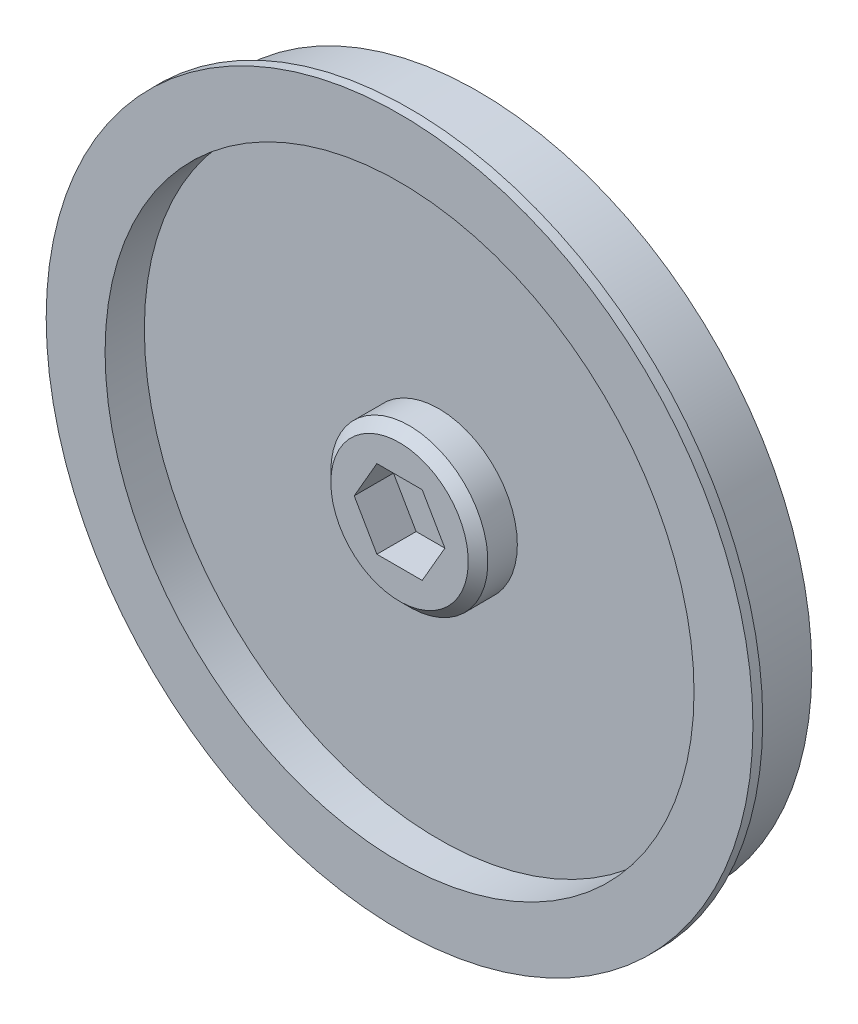
ISO-10303-21;
HEADER;
FILE_DESCRIPTION(('STEP AP214'),'2;1');
FILE_NAME('part.step','',(''),(''),'','','');
FILE_SCHEMA(('AUTOMOTIVE_DESIGN { 1 0 10303 214 1 1 1 1 }'));
ENDSEC;
DATA;
#1=APPLICATION_CONTEXT('core data for automotive mechanical design processes');
#2=APPLICATION_PROTOCOL_DEFINITION('international standard','automotive_design',2000,#1);
#3=PRODUCT_CONTEXT('',#1,'mechanical');
#4=PRODUCT('Part','Part','',(#3));
#5=PRODUCT_RELATED_PRODUCT_CATEGORY('part','',(#4));
#6=PRODUCT_DEFINITION_FORMATION('','',#4);
#7=PRODUCT_DEFINITION_CONTEXT('part definition',#1,'design');
#8=PRODUCT_DEFINITION('design','',#6,#7);
#9=PRODUCT_DEFINITION_SHAPE('','',#8);
#10=(LENGTH_UNIT() NAMED_UNIT(*) SI_UNIT(.MILLI.,.METRE.));
#11=(NAMED_UNIT(*) PLANE_ANGLE_UNIT() SI_UNIT($,.RADIAN.));
#12=(NAMED_UNIT(*) SI_UNIT($,.STERADIAN.) SOLID_ANGLE_UNIT());
#13=UNCERTAINTY_MEASURE_WITH_UNIT(LENGTH_MEASURE(1.E-05),#10,'distance_accuracy_value','');
#14=(GEOMETRIC_REPRESENTATION_CONTEXT(3) GLOBAL_UNCERTAINTY_ASSIGNED_CONTEXT((#13)) GLOBAL_UNIT_ASSIGNED_CONTEXT((#10,
#11,#12)) REPRESENTATION_CONTEXT('',''));
#15=CARTESIAN_POINT('',(0.,0.,0.));
#16=DIRECTION('',(0.,0.,1.));
#17=DIRECTION('',(1.,0.,0.));
#18=AXIS2_PLACEMENT_3D('',#15,#16,#17);
#19=CARTESIAN_POINT('',(0.,0.,6.35));
#20=DIRECTION('',(0.,0.,1.));
#21=DIRECTION('',(1.,0.,0.));
#22=AXIS2_PLACEMENT_3D('',#19,#20,#21);
#23=PLANE('',#22);
#24=CARTESIAN_POINT('',(0.,0.,6.35));
#25=DIRECTION('',(0.,0.,1.));
#26=DIRECTION('',(1.,0.,0.));
#27=AXIS2_PLACEMENT_3D('',#24,#25,#26);
#28=CIRCLE('',#27,47.625);
#29=CARTESIAN_POINT('',(47.625,0.,6.35));
#30=VERTEX_POINT('',#29);
#31=EDGE_CURVE('E140',#30,#30,#28,.T.);
#32=ORIENTED_EDGE('',*,*,#31,.T.);
#33=EDGE_LOOP('',(#32));
#34=FACE_BOUND('',#33,.T.);
#35=CARTESIAN_POINT('',(0.,0.,6.35));
#36=DIRECTION('',(0.,0.,1.));
#37=DIRECTION('',(1.,0.,0.));
#38=AXIS2_PLACEMENT_3D('',#35,#36,#37);
#39=CIRCLE('',#38,12.7);
#40=CARTESIAN_POINT('',(12.7,0.,6.35));
#41=VERTEX_POINT('',#40);
#42=EDGE_CURVE('E100',#41,#41,#39,.T.);
#43=ORIENTED_EDGE('',*,*,#42,.F.);
#44=EDGE_LOOP('',(#43));
#45=FACE_BOUND('',#44,.T.);
#46=ADVANCED_FACE('F33',(#34,#45),#23,.T.);
#47=CARTESIAN_POINT('',(0.,0.,11.1125));
#48=DIRECTION('',(0.,0.,-1.));
#49=DIRECTION('',(-1.,0.,0.));
#50=AXIS2_PLACEMENT_3D('',#47,#48,#49);
#51=CYLINDRICAL_SURFACE('',#50,53.975);
#52=CARTESIAN_POINT('',(0.,0.,11.1125));
#53=DIRECTION('',(0.,0.,1.));
#54=DIRECTION('',(1.,0.,0.));
#55=AXIS2_PLACEMENT_3D('',#52,#53,#54);
#56=CIRCLE('',#55,53.975);
#57=CARTESIAN_POINT('',(53.975,0.,11.1125));
#58=VERTEX_POINT('',#57);
#59=EDGE_CURVE('E152',#58,#58,#56,.T.);
#60=ORIENTED_EDGE('',*,*,#59,.F.);
#61=EDGE_LOOP('',(#60));
#62=FACE_BOUND('',#61,.T.);
#63=CARTESIAN_POINT('',(0.,0.,0.));
#64=DIRECTION('',(0.,0.,1.));
#65=DIRECTION('',(1.,0.,0.));
#66=AXIS2_PLACEMENT_3D('',#63,#64,#65);
#67=CIRCLE('',#66,53.975);
#68=CARTESIAN_POINT('',(53.975,0.,0.));
#69=VERTEX_POINT('',#68);
#70=EDGE_CURVE('E149',#69,#69,#67,.T.);
#71=ORIENTED_EDGE('',*,*,#70,.T.);
#72=EDGE_LOOP('',(#71));
#73=FACE_BOUND('',#72,.T.);
#74=ADVANCED_FACE('F170',(#62,#73),#51,.T.);
#75=CARTESIAN_POINT('',(0.,0.,0.));
#76=DIRECTION('',(0.,0.,1.));
#77=DIRECTION('',(1.,0.,0.));
#78=AXIS2_PLACEMENT_3D('',#75,#76,#77);
#79=PLANE('',#78);
#80=ORIENTED_EDGE('',*,*,#70,.F.);
#81=EDGE_LOOP('',(#80));
#82=FACE_BOUND('',#81,.T.);
#83=ADVANCED_FACE('F175',(#82),#79,.F.);
#84=CARTESIAN_POINT('',(0.,0.,11.1125));
#85=DIRECTION('',(0.,0.,1.));
#86=DIRECTION('',(1.,0.,0.));
#87=AXIS2_PLACEMENT_3D('',#84,#85,#86);
#88=PLANE('',#87);
#89=CARTESIAN_POINT('',(0.,0.,11.1125));
#90=DIRECTION('',(0.,0.,1.));
#91=DIRECTION('',(1.,0.,0.));
#92=AXIS2_PLACEMENT_3D('',#89,#90,#91);
#93=CIRCLE('',#92,57.15);
#94=CARTESIAN_POINT('',(57.15,0.,11.1125));
#95=VERTEX_POINT('',#94);
#96=EDGE_CURVE('E143',#95,#95,#93,.T.);
#97=ORIENTED_EDGE('',*,*,#96,.F.);
#98=EDGE_LOOP('',(#97));
#99=FACE_BOUND('',#98,.T.);
#100=ORIENTED_EDGE('',*,*,#59,.T.);
#101=EDGE_LOOP('',(#100));
#102=FACE_BOUND('',#101,.T.);
#103=ADVANCED_FACE('F191',(#99,#102),#88,.F.);
#104=CARTESIAN_POINT('',(0.,0.,12.7));
#105=DIRECTION('',(0.,0.,-1.));
#106=DIRECTION('',(-1.,0.,0.));
#107=AXIS2_PLACEMENT_3D('',#104,#105,#106);
#108=CYLINDRICAL_SURFACE('',#107,57.15);
#109=CARTESIAN_POINT('',(0.,0.,12.7));
#110=DIRECTION('',(0.,0.,1.));
#111=DIRECTION('',(1.,0.,0.));
#112=AXIS2_PLACEMENT_3D('',#109,#110,#111);
#113=CIRCLE('',#112,57.15);
#114=CARTESIAN_POINT('',(57.15,0.,12.7));
#115=VERTEX_POINT('',#114);
#116=EDGE_CURVE('E146',#115,#115,#113,.T.);
#117=ORIENTED_EDGE('',*,*,#116,.F.);
#118=EDGE_LOOP('',(#117));
#119=FACE_BOUND('',#118,.T.);
#120=ORIENTED_EDGE('',*,*,#96,.T.);
#121=EDGE_LOOP('',(#120));
#122=FACE_BOUND('',#121,.T.);
#123=ADVANCED_FACE('F189',(#119,#122),#108,.T.);
#124=CARTESIAN_POINT('',(0.,0.,12.7));
#125=DIRECTION('',(0.,0.,1.));
#126=DIRECTION('',(1.,0.,0.));
#127=AXIS2_PLACEMENT_3D('',#124,#125,#126);
#128=PLANE('',#127);
#129=CARTESIAN_POINT('',(0.,0.,12.7));
#130=DIRECTION('',(0.,0.,1.));
#131=DIRECTION('',(1.,0.,0.));
#132=AXIS2_PLACEMENT_3D('',#129,#130,#131);
#133=CIRCLE('',#132,47.625);
#134=CARTESIAN_POINT('',(47.625,0.,12.7));
#135=VERTEX_POINT('',#134);
#136=EDGE_CURVE('E139',#135,#135,#133,.T.);
#137=ORIENTED_EDGE('',*,*,#136,.F.);
#138=EDGE_LOOP('',(#137));
#139=FACE_BOUND('',#138,.T.);
#140=ORIENTED_EDGE('',*,*,#116,.T.);
#141=EDGE_LOOP('',(#140));
#142=FACE_BOUND('',#141,.T.);
#143=ADVANCED_FACE('F185',(#139,#142),#128,.T.);
#144=CARTESIAN_POINT('',(0.,0.,6.35));
#145=DIRECTION('',(0.,0.,1.));
#146=DIRECTION('',(1.,0.,0.));
#147=AXIS2_PLACEMENT_3D('',#144,#145,#146);
#148=CYLINDRICAL_SURFACE('',#147,47.625);
#149=ORIENTED_EDGE('',*,*,#31,.F.);
#150=EDGE_LOOP('',(#149));
#151=FACE_BOUND('',#150,.T.);
#152=ORIENTED_EDGE('',*,*,#136,.T.);
#153=EDGE_LOOP('',(#152));
#154=FACE_BOUND('',#153,.T.);
#155=ADVANCED_FACE('F182',(#151,#154),#148,.F.);
#156=CARTESIAN_POINT('',(0.,0.,12.7));
#157=DIRECTION('',(0.,0.,1.));
#158=DIRECTION('',(1.,0.,0.));
#159=AXIS2_PLACEMENT_3D('',#156,#157,#158);
#160=PLANE('',#159);
#161=CARTESIAN_POINT('',(0.,0.,12.7));
#162=DIRECTION('',(0.,0.,1.));
#163=DIRECTION('',(1.,0.,0.));
#164=AXIS2_PLACEMENT_3D('',#161,#162,#163);
#165=CIRCLE('',#164,11.1125);
#166=CARTESIAN_POINT('',(-11.1125,0.,12.7));
#167=VERTEX_POINT('',#166);
#168=EDGE_CURVE('E41',#167,#167,#165,.T.);
#169=ORIENTED_EDGE('',*,*,#168,.T.);
#170=EDGE_LOOP('',(#169));
#171=FACE_BOUND('',#170,.T.);
#172=DIRECTION('',(-0.5,0.866025403784438,0.));
#173=VECTOR('',#172,1.);
#174=CARTESIAN_POINT('',(7.33234841870825,0.,12.7));
#175=LINE('',#174,#173);
#176=CARTESIAN_POINT('',(7.33234841870825,0.,12.7));
#177=VERTEX_POINT('',#176);
#178=CARTESIAN_POINT('',(3.66617420935412,6.35,12.7));
#179=VERTEX_POINT('',#178);
#180=EDGE_CURVE('E94',#177,#179,#175,.T.);
#181=ORIENTED_EDGE('',*,*,#180,.F.);
#182=DIRECTION('',(0.5,0.866025403784439,0.));
#183=VECTOR('',#182,1.);
#184=CARTESIAN_POINT('',(3.66617420935413,-6.35,12.7));
#185=LINE('',#184,#183);
#186=CARTESIAN_POINT('',(3.66617420935413,-6.35,12.7));
#187=VERTEX_POINT('',#186);
#188=EDGE_CURVE('E85',#187,#177,#185,.T.);
#189=ORIENTED_EDGE('',*,*,#188,.F.);
#190=DIRECTION('',(1.,0.,0.));
#191=VECTOR('',#190,1.);
#192=CARTESIAN_POINT('',(-3.66617420935412,-6.35,12.7));
#193=LINE('',#192,#191);
#194=CARTESIAN_POINT('',(-3.66617420935412,-6.35,12.7));
#195=VERTEX_POINT('',#194);
#196=EDGE_CURVE('E115',#195,#187,#193,.T.);
#197=ORIENTED_EDGE('',*,*,#196,.F.);
#198=DIRECTION('',(0.5,-0.866025403784439,0.));
#199=VECTOR('',#198,1.);
#200=CARTESIAN_POINT('',(-7.33234841870825,0.,12.7));
#201=LINE('',#200,#199);
#202=CARTESIAN_POINT('',(-7.33234841870825,0.,12.7));
#203=VERTEX_POINT('',#202);
#204=EDGE_CURVE('E112',#203,#195,#201,.T.);
#205=ORIENTED_EDGE('',*,*,#204,.F.);
#206=DIRECTION('',(-0.5,-0.866025403784439,0.));
#207=VECTOR('',#206,1.);
#208=CARTESIAN_POINT('',(-3.66617420935412,6.35,12.7));
#209=LINE('',#208,#207);
#210=CARTESIAN_POINT('',(-3.66617420935412,6.35,12.7));
#211=VERTEX_POINT('',#210);
#212=EDGE_CURVE('E108',#211,#203,#209,.T.);
#213=ORIENTED_EDGE('',*,*,#212,.F.);
#214=DIRECTION('',(-1.,0.,0.));
#215=VECTOR('',#214,1.);
#216=CARTESIAN_POINT('',(3.66617420935412,6.35,12.7));
#217=LINE('',#216,#215);
#218=EDGE_CURVE('E106',#179,#211,#217,.T.);
#219=ORIENTED_EDGE('',*,*,#218,.F.);
#220=EDGE_LOOP('',(#181,#189,#197,#205,#213,#219));
#221=FACE_BOUND('',#220,.T.);
#222=ADVANCED_FACE('F104',(#171,#221),#160,.T.);
#223=CARTESIAN_POINT('',(0.,0.,12.7));
#224=DIRECTION('',(0.,0.,-1.));
#225=DIRECTION('',(-1.,0.,0.));
#226=AXIS2_PLACEMENT_3D('',#223,#224,#225);
#227=CYLINDRICAL_SURFACE('',#226,12.7);
#228=CARTESIAN_POINT('',(0.,0.,11.1125));
#229=DIRECTION('',(0.,0.,1.));
#230=DIRECTION('',(1.,0.,0.));
#231=AXIS2_PLACEMENT_3D('',#228,#229,#230);
#232=CIRCLE('',#231,12.7);
#233=CARTESIAN_POINT('',(-12.7,0.,11.1125));
#234=VERTEX_POINT('',#233);
#235=EDGE_CURVE('E11',#234,#234,#232,.F.);
#236=ORIENTED_EDGE('',*,*,#235,.T.);
#237=EDGE_LOOP('',(#236));
#238=FACE_BOUND('',#237,.T.);
#239=ORIENTED_EDGE('',*,*,#42,.T.);
#240=EDGE_LOOP('',(#239));
#241=FACE_BOUND('',#240,.T.);
#242=ADVANCED_FACE('F180',(#238,#241),#227,.T.);
#243=CARTESIAN_POINT('',(3.66617420935413,-6.35,12.7));
#244=DIRECTION('',(-0.866025403784439,0.5,0.));
#245=DIRECTION('',(-0.5,-0.866025403784439,0.));
#246=AXIS2_PLACEMENT_3D('',#243,#244,#245);
#247=PLANE('',#246);
#248=DIRECTION('',(0.5,0.866025403784439,0.));
#249=VECTOR('',#248,1.);
#250=CARTESIAN_POINT('',(3.66617420935413,-6.35,6.35));
#251=LINE('',#250,#249);
#252=CARTESIAN_POINT('',(3.66617420935413,-6.35,6.35));
#253=VERTEX_POINT('',#252);
#254=CARTESIAN_POINT('',(7.33234841870825,0.,6.35));
#255=VERTEX_POINT('',#254);
#256=EDGE_CURVE('E48',#253,#255,#251,.T.);
#257=ORIENTED_EDGE('',*,*,#256,.F.);
#258=DIRECTION('',(0.,0.,-1.));
#259=VECTOR('',#258,1.);
#260=CARTESIAN_POINT('',(3.66617420935413,-6.35,12.7));
#261=LINE('',#260,#259);
#262=EDGE_CURVE('E90',#187,#253,#261,.T.);
#263=ORIENTED_EDGE('',*,*,#262,.F.);
#264=ORIENTED_EDGE('',*,*,#188,.T.);
#265=DIRECTION('',(0.,0.,-1.));
#266=VECTOR('',#265,1.);
#267=CARTESIAN_POINT('',(7.33234841870825,0.,12.7));
#268=LINE('',#267,#266);
#269=EDGE_CURVE('E88',#177,#255,#268,.T.);
#270=ORIENTED_EDGE('',*,*,#269,.T.);
#271=EDGE_LOOP('',(#257,#263,#264,#270));
#272=FACE_BOUND('',#271,.T.);
#273=ADVANCED_FACE('F87',(#272),#247,.T.);
#274=CARTESIAN_POINT('',(7.33234841870825,0.,12.7));
#275=DIRECTION('',(-0.866025403784439,-0.5,0.));
#276=DIRECTION('',(0.5,-0.866025403784439,0.));
#277=AXIS2_PLACEMENT_3D('',#274,#275,#276);
#278=PLANE('',#277);
#279=DIRECTION('',(-0.5,0.866025403784438,0.));
#280=VECTOR('',#279,1.);
#281=CARTESIAN_POINT('',(7.33234841870825,0.,6.35));
#282=LINE('',#281,#280);
#283=CARTESIAN_POINT('',(3.66617420935412,6.35,6.35));
#284=VERTEX_POINT('',#283);
#285=EDGE_CURVE('E52',#255,#284,#282,.T.);
#286=ORIENTED_EDGE('',*,*,#285,.F.);
#287=ORIENTED_EDGE('',*,*,#269,.F.);
#288=ORIENTED_EDGE('',*,*,#180,.T.);
#289=DIRECTION('',(0.,0.,-1.));
#290=VECTOR('',#289,1.);
#291=CARTESIAN_POINT('',(3.66617420935412,6.35,12.7));
#292=LINE('',#291,#290);
#293=EDGE_CURVE('E101',#179,#284,#292,.T.);
#294=ORIENTED_EDGE('',*,*,#293,.T.);
#295=EDGE_LOOP('',(#286,#287,#288,#294));
#296=FACE_BOUND('',#295,.T.);
#297=ADVANCED_FACE('F98',(#296),#278,.T.);
#298=CARTESIAN_POINT('',(3.66617420935412,6.35,12.7));
#299=DIRECTION('',(0.,-1.,0.));
#300=DIRECTION('',(1.,0.,0.));
#301=AXIS2_PLACEMENT_3D('',#298,#299,#300);
#302=PLANE('',#301);
#303=DIRECTION('',(-1.,0.,0.));
#304=VECTOR('',#303,1.);
#305=CARTESIAN_POINT('',(3.66617420935412,6.35,6.35));
#306=LINE('',#305,#304);
#307=CARTESIAN_POINT('',(-3.66617420935412,6.35,6.35));
#308=VERTEX_POINT('',#307);
#309=EDGE_CURVE('E119',#284,#308,#306,.T.);
#310=ORIENTED_EDGE('',*,*,#309,.F.);
#311=ORIENTED_EDGE('',*,*,#293,.F.);
#312=ORIENTED_EDGE('',*,*,#218,.T.);
#313=DIRECTION('',(0.,0.,-1.));
#314=VECTOR('',#313,1.);
#315=CARTESIAN_POINT('',(-3.66617420935412,6.35,12.7));
#316=LINE('',#315,#314);
#317=EDGE_CURVE('E133',#211,#308,#316,.T.);
#318=ORIENTED_EDGE('',*,*,#317,.T.);
#319=EDGE_LOOP('',(#310,#311,#312,#318));
#320=FACE_BOUND('',#319,.T.);
#321=ADVANCED_FACE('F246',(#320),#302,.T.);
#322=CARTESIAN_POINT('',(-3.66617420935412,6.35,12.7));
#323=DIRECTION('',(0.866025403784439,-0.5,0.));
#324=DIRECTION('',(0.5,0.866025403784439,0.));
#325=AXIS2_PLACEMENT_3D('',#322,#323,#324);
#326=PLANE('',#325);
#327=DIRECTION('',(-0.5,-0.866025403784439,0.));
#328=VECTOR('',#327,1.);
#329=CARTESIAN_POINT('',(-3.66617420935412,6.35,6.35));
#330=LINE('',#329,#328);
#331=CARTESIAN_POINT('',(-7.33234841870825,0.,6.35));
#332=VERTEX_POINT('',#331);
#333=EDGE_CURVE('E121',#308,#332,#330,.T.);
#334=ORIENTED_EDGE('',*,*,#333,.F.);
#335=ORIENTED_EDGE('',*,*,#317,.F.);
#336=ORIENTED_EDGE('',*,*,#212,.T.);
#337=DIRECTION('',(0.,0.,-1.));
#338=VECTOR('',#337,1.);
#339=CARTESIAN_POINT('',(-7.33234841870825,0.,12.7));
#340=LINE('',#339,#338);
#341=EDGE_CURVE('E130',#203,#332,#340,.T.);
#342=ORIENTED_EDGE('',*,*,#341,.T.);
#343=EDGE_LOOP('',(#334,#335,#336,#342));
#344=FACE_BOUND('',#343,.T.);
#345=ADVANCED_FACE('F253',(#344),#326,.T.);
#346=CARTESIAN_POINT('',(-7.33234841870825,0.,12.7));
#347=DIRECTION('',(0.866025403784439,0.5,0.));
#348=DIRECTION('',(-0.5,0.866025403784439,0.));
#349=AXIS2_PLACEMENT_3D('',#346,#347,#348);
#350=PLANE('',#349);
#351=DIRECTION('',(0.5,-0.866025403784439,0.));
#352=VECTOR('',#351,1.);
#353=CARTESIAN_POINT('',(-7.33234841870825,0.,6.35));
#354=LINE('',#353,#352);
#355=CARTESIAN_POINT('',(-3.66617420935412,-6.35,6.35));
#356=VERTEX_POINT('',#355);
#357=EDGE_CURVE('E123',#332,#356,#354,.T.);
#358=ORIENTED_EDGE('',*,*,#357,.F.);
#359=ORIENTED_EDGE('',*,*,#341,.F.);
#360=ORIENTED_EDGE('',*,*,#204,.T.);
#361=DIRECTION('',(0.,0.,-1.));
#362=VECTOR('',#361,1.);
#363=CARTESIAN_POINT('',(-3.66617420935412,-6.35,12.7));
#364=LINE('',#363,#362);
#365=EDGE_CURVE('E127',#195,#356,#364,.T.);
#366=ORIENTED_EDGE('',*,*,#365,.T.);
#367=EDGE_LOOP('',(#358,#359,#360,#366));
#368=FACE_BOUND('',#367,.T.);
#369=ADVANCED_FACE('F261',(#368),#350,.T.);
#370=CARTESIAN_POINT('',(-3.66617420935412,-6.35,12.7));
#371=DIRECTION('',(0.,1.,0.));
#372=DIRECTION('',(0.,0.,1.));
#373=AXIS2_PLACEMENT_3D('',#370,#371,#372);
#374=PLANE('',#373);
#375=DIRECTION('',(1.,0.,0.));
#376=VECTOR('',#375,1.);
#377=CARTESIAN_POINT('',(-3.66617420935412,-6.35,6.35));
#378=LINE('',#377,#376);
#379=EDGE_CURVE('E95',#356,#253,#378,.T.);
#380=ORIENTED_EDGE('',*,*,#379,.F.);
#381=ORIENTED_EDGE('',*,*,#365,.F.);
#382=ORIENTED_EDGE('',*,*,#196,.T.);
#383=ORIENTED_EDGE('',*,*,#262,.T.);
#384=EDGE_LOOP('',(#380,#381,#382,#383));
#385=FACE_BOUND('',#384,.T.);
#386=ADVANCED_FACE('F166',(#385),#374,.T.);
#387=ORIENTED_EDGE('',*,*,#256,.T.);
#388=ORIENTED_EDGE('',*,*,#285,.T.);
#389=ORIENTED_EDGE('',*,*,#309,.T.);
#390=ORIENTED_EDGE('',*,*,#333,.T.);
#391=ORIENTED_EDGE('',*,*,#357,.T.);
#392=ORIENTED_EDGE('',*,*,#379,.T.);
#393=EDGE_LOOP('',(#387,#388,#389,#390,#391,#392));
#394=FACE_BOUND('',#393,.T.);
#395=ADVANCED_FACE('F161',(#394),#23,.T.);
#396=CARTESIAN_POINT('',(0.,0.,12.7));
#397=DIRECTION('',(0.,0.,-1.));
#398=DIRECTION('',(-1.,0.,0.));
#399=AXIS2_PLACEMENT_3D('',#396,#397,#398);
#400=CONICAL_SURFACE('',#399,11.1125,0.785398163397445);
#401=CARTESIAN_POINT('',(-12.7,0.,11.1125));
#402=CARTESIAN_POINT('',(-12.6834635416667,0.,11.1290364583333));
#403=CARTESIAN_POINT('',(-12.6669270833333,0.,11.1455729166667));
#404=CARTESIAN_POINT('',(-12.6338541666667,0.,11.1786458333333));
#405=CARTESIAN_POINT('',(-12.6173177083333,0.,11.1951822916667));
#406=CARTESIAN_POINT('',(-12.5842447916667,0.,11.2282552083333));
#407=CARTESIAN_POINT('',(-12.5677083333333,0.,11.2447916666667));
#408=CARTESIAN_POINT('',(-12.5346354166667,0.,11.2778645833333));
#409=CARTESIAN_POINT('',(-12.5180989583333,0.,11.2944010416667));
#410=CARTESIAN_POINT('',(-12.4850260416667,0.,11.3274739583333));
#411=CARTESIAN_POINT('',(-12.4684895833333,0.,11.3440104166667));
#412=CARTESIAN_POINT('',(-12.4354166666667,0.,11.3770833333333));
#413=CARTESIAN_POINT('',(-12.4188802083333,0.,11.3936197916667));
#414=CARTESIAN_POINT('',(-12.3858072916667,0.,11.4266927083333));
#415=CARTESIAN_POINT('',(-12.3692708333333,0.,11.4432291666667));
#416=CARTESIAN_POINT('',(-12.3361979166667,0.,11.4763020833333));
#417=CARTESIAN_POINT('',(-12.3196614583333,0.,11.4928385416667));
#418=CARTESIAN_POINT('',(-12.2865885416667,0.,11.5259114583333));
#419=CARTESIAN_POINT('',(-12.2700520833333,0.,11.5424479166667));
#420=CARTESIAN_POINT('',(-12.2369791666667,0.,11.5755208333333));
#421=CARTESIAN_POINT('',(-12.2204427083333,0.,11.5920572916667));
#422=CARTESIAN_POINT('',(-12.1873697916667,0.,11.6251302083333));
#423=CARTESIAN_POINT('',(-12.1708333333333,0.,11.6416666666667));
#424=CARTESIAN_POINT('',(-12.1377604166667,0.,11.6747395833333));
#425=CARTESIAN_POINT('',(-12.1212239583333,0.,11.6912760416667));
#426=CARTESIAN_POINT('',(-12.0881510416667,0.,11.7243489583333));
#427=CARTESIAN_POINT('',(-12.0716145833333,0.,11.7408854166667));
#428=CARTESIAN_POINT('',(-12.0385416666667,0.,11.7739583333333));
#429=CARTESIAN_POINT('',(-12.0220052083333,0.,11.7904947916667));
#430=CARTESIAN_POINT('',(-11.9889322916667,0.,11.8235677083333));
#431=CARTESIAN_POINT('',(-11.9723958333333,0.,11.8401041666667));
#432=CARTESIAN_POINT('',(-11.9393229166667,0.,11.8731770833333));
#433=CARTESIAN_POINT('',(-11.9227864583333,0.,11.8897135416667));
#434=CARTESIAN_POINT('',(-11.8897135416667,0.,11.9227864583333));
#435=CARTESIAN_POINT('',(-11.8731770833333,0.,11.9393229166667));
#436=CARTESIAN_POINT('',(-11.8401041666667,0.,11.9723958333333));
#437=CARTESIAN_POINT('',(-11.8235677083333,0.,11.9889322916667));
#438=CARTESIAN_POINT('',(-11.7904947916667,0.,12.0220052083333));
#439=CARTESIAN_POINT('',(-11.7739583333333,0.,12.0385416666667));
#440=CARTESIAN_POINT('',(-11.7408854166667,0.,12.0716145833333));
#441=CARTESIAN_POINT('',(-11.7243489583333,0.,12.0881510416667));
#442=CARTESIAN_POINT('',(-11.6912760416667,0.,12.1212239583333));
#443=CARTESIAN_POINT('',(-11.6747395833333,0.,12.1377604166667));
#444=CARTESIAN_POINT('',(-11.6416666666667,0.,12.1708333333333));
#445=CARTESIAN_POINT('',(-11.6251302083333,0.,12.1873697916667));
#446=CARTESIAN_POINT('',(-11.5920572916667,0.,12.2204427083333));
#447=CARTESIAN_POINT('',(-11.5755208333333,0.,12.2369791666667));
#448=CARTESIAN_POINT('',(-11.5424479166667,0.,12.2700520833333));
#449=CARTESIAN_POINT('',(-11.5259114583333,0.,12.2865885416667));
#450=CARTESIAN_POINT('',(-11.4928385416667,0.,12.3196614583333));
#451=CARTESIAN_POINT('',(-11.4763020833333,0.,12.3361979166667));
#452=CARTESIAN_POINT('',(-11.4432291666667,0.,12.3692708333333));
#453=CARTESIAN_POINT('',(-11.4266927083333,0.,12.3858072916667));
#454=CARTESIAN_POINT('',(-11.3936197916667,0.,12.4188802083333));
#455=CARTESIAN_POINT('',(-11.3770833333333,0.,12.4354166666667));
#456=CARTESIAN_POINT('',(-11.3440104166667,0.,12.4684895833333));
#457=CARTESIAN_POINT('',(-11.3274739583333,0.,12.4850260416667));
#458=CARTESIAN_POINT('',(-11.2944010416667,0.,12.5180989583333));
#459=CARTESIAN_POINT('',(-11.2778645833333,0.,12.5346354166667));
#460=CARTESIAN_POINT('',(-11.2447916666667,0.,12.5677083333333));
#461=CARTESIAN_POINT('',(-11.2282552083333,0.,12.5842447916667));
#462=CARTESIAN_POINT('',(-11.1951822916667,0.,12.6173177083333));
#463=CARTESIAN_POINT('',(-11.1786458333333,0.,12.6338541666667));
#464=CARTESIAN_POINT('',(-11.1455729166667,0.,12.6669270833333));
#465=CARTESIAN_POINT('',(-11.1290364583333,0.,12.6834635416667));
#466=CARTESIAN_POINT('',(-11.1125,0.,12.7));
#467=B_SPLINE_CURVE_WITH_KNOTS('',3,(#401,#402,#403,#404,#405,#406,#407,#408,#409,#410,#411,
#412,#413,#414,#415,#416,#417,#418,#419,#420,#421,#422,#423,#424,#425,#426,#427,#428,#429,#430,
#431,#432,#433,#434,#435,#436,#437,#438,#439,#440,#441,#442,#443,#444,#445,#446,#447,#448,#449,
#450,#451,#452,#453,#454,#455,#456,#457,#458,#459,#460,#461,#462,#463,#464,#465,#466),
.UNSPECIFIED.,.F.,.F.,(4,2,2,2,2,2,2,2,2,2,2,2,2,2,2,2,2,2,2,2,2,2,2,2,2,2,2,2,2,2,2,2,4),(0.,
0.0701582509458536,0.140316501891706,0.21047475283756,0.280633003783411,0.350791254729264,
0.420949505675117,0.491107756620969,0.561266007566822,0.631424258512675,0.701582509458526,
0.771740760404379,0.841899011350232,0.912057262296085,0.982215513241937,1.05237376418779,
1.12253201513364,1.19269026607949,1.26284851702535,1.3330067679712,1.40316501891705,
1.47332326986291,1.54348152080876,1.61363977175461,1.68379802270046,1.75395627364632,
1.82411452459217,1.89427277553802,1.96443102648387,2.03458927742973,2.10474752837558,
2.17490577932143,2.24506403026729),.UNSPECIFIED.);
#468=EDGE_CURVE('BSEAM35',#234,#167,#467,.T.);
#469=ORIENTED_EDGE('',*,*,#235,.F.);
#470=ORIENTED_EDGE('',*,*,#168,.F.);
#471=ORIENTED_EDGE('',*,*,#468,.T.);
#472=ORIENTED_EDGE('',*,*,#468,.F.);
#473=EDGE_LOOP('',(#469,#471,#470,#472));
#474=FACE_BOUND('',#473,.T.);
#475=ADVANCED_FACE('F35',(#474),#400,.T.);
#476=CLOSED_SHELL('',(#46,#74,#83,#103,#123,#143,#155,#222,#242,#273,#297,#321,#345,#369,#386,
#395,#475));
#477=MANIFOLD_SOLID_BREP('B2',#476);
#478=ADVANCED_BREP_SHAPE_REPRESENTATION('',(#18,#477),#14);
#479=SHAPE_DEFINITION_REPRESENTATION(#9,#478);
ENDSEC;
END-ISO-10303-21;
